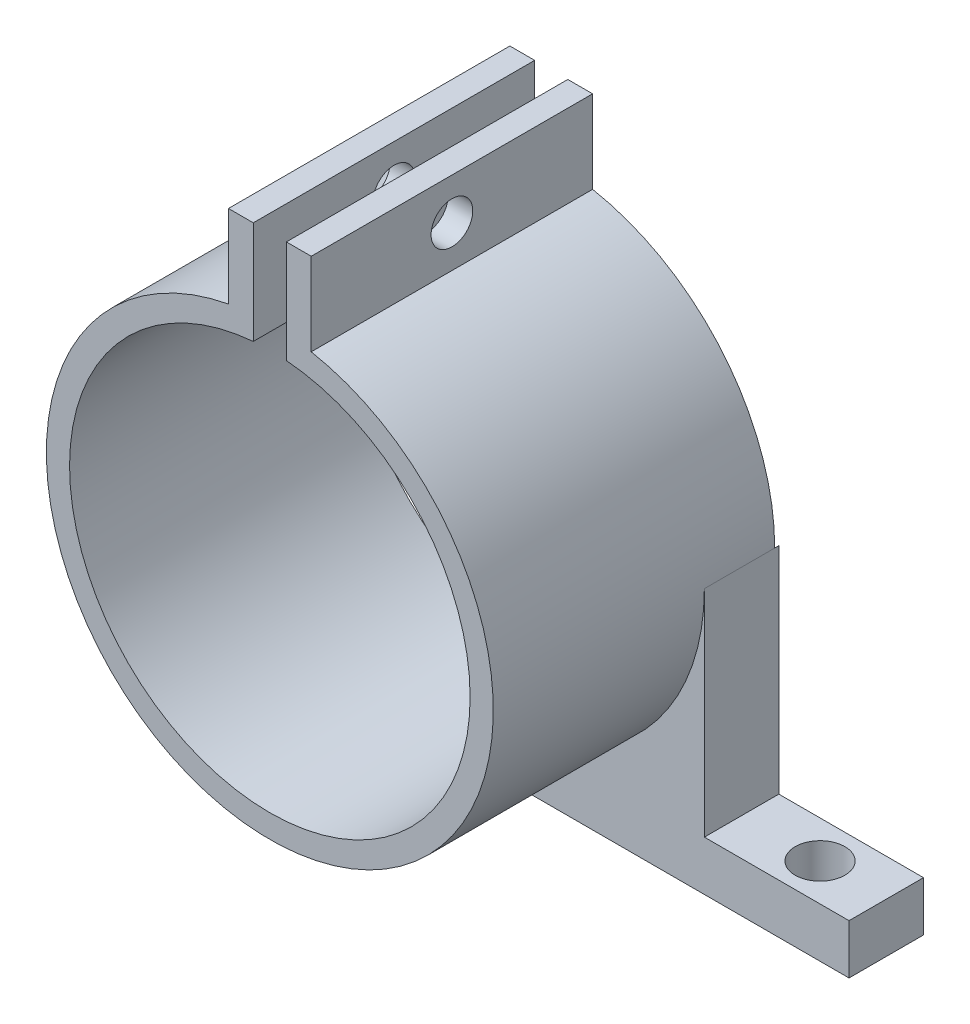
ISO-10303-21;
HEADER;
FILE_DESCRIPTION(('STEP AP214'),'2;1');
FILE_NAME('part.step','',(''),(''),'','','');
FILE_SCHEMA(('AUTOMOTIVE_DESIGN { 1 0 10303 214 1 1 1 1 }'));
ENDSEC;
DATA;
#1=APPLICATION_CONTEXT('core data for automotive mechanical design processes');
#2=APPLICATION_PROTOCOL_DEFINITION('international standard','automotive_design',2000,#1);
#3=PRODUCT_CONTEXT('',#1,'mechanical');
#4=PRODUCT('Part','Part','',(#3));
#5=PRODUCT_RELATED_PRODUCT_CATEGORY('part','',(#4));
#6=PRODUCT_DEFINITION_FORMATION('','',#4);
#7=PRODUCT_DEFINITION_CONTEXT('part definition',#1,'design');
#8=PRODUCT_DEFINITION('design','',#6,#7);
#9=PRODUCT_DEFINITION_SHAPE('','',#8);
#10=(LENGTH_UNIT() NAMED_UNIT(*) SI_UNIT(.MILLI.,.METRE.));
#11=(NAMED_UNIT(*) PLANE_ANGLE_UNIT() SI_UNIT($,.RADIAN.));
#12=(NAMED_UNIT(*) SI_UNIT($,.STERADIAN.) SOLID_ANGLE_UNIT());
#13=UNCERTAINTY_MEASURE_WITH_UNIT(LENGTH_MEASURE(1.E-05),#10,'distance_accuracy_value','');
#14=(GEOMETRIC_REPRESENTATION_CONTEXT(3) GLOBAL_UNCERTAINTY_ASSIGNED_CONTEXT((#13)) GLOBAL_UNIT_ASSIGNED_CONTEXT((#10,
#11,#12)) REPRESENTATION_CONTEXT('',''));
#15=CARTESIAN_POINT('',(0.,0.,0.));
#16=DIRECTION('',(0.,0.,1.));
#17=DIRECTION('',(1.,0.,0.));
#18=AXIS2_PLACEMENT_3D('',#15,#16,#17);
#19=CARTESIAN_POINT('',(0.,3.,0.));
#20=DIRECTION('',(0.,1.,0.));
#21=DIRECTION('',(0.,0.,1.));
#22=AXIS2_PLACEMENT_3D('',#19,#20,#21);
#23=PLANE('',#22);
#24=CARTESIAN_POINT('',(-18.24,3.,0.));
#25=DIRECTION('',(0.,1.,0.));
#26=DIRECTION('',(0.,0.,1.));
#27=AXIS2_PLACEMENT_3D('',#24,#25,#26);
#28=CIRCLE('',#27,1.5);
#29=CARTESIAN_POINT('',(-18.24,3.,1.5));
#30=VERTEX_POINT('',#29);
#31=EDGE_CURVE('E332',#30,#30,#28,.T.);
#32=ORIENTED_EDGE('',*,*,#31,.F.);
#33=EDGE_LOOP('',(#32));
#34=FACE_BOUND('',#33,.T.);
#35=DIRECTION('',(1.,0.,0.));
#36=VECTOR('',#35,1.);
#37=CARTESIAN_POINT('',(-22.24,3.,2.25));
#38=LINE('',#37,#36);
#39=CARTESIAN_POINT('',(-22.24,3.,2.25));
#40=VERTEX_POINT('',#39);
#41=CARTESIAN_POINT('',(-13.5,3.,2.25));
#42=VERTEX_POINT('',#41);
#43=EDGE_CURVE('E353',#40,#42,#38,.T.);
#44=ORIENTED_EDGE('',*,*,#43,.T.);
#45=DIRECTION('',(0.,0.,-1.));
#46=VECTOR('',#45,1.);
#47=CARTESIAN_POINT('',(-13.5,3.,2.25));
#48=LINE('',#47,#46);
#49=CARTESIAN_POINT('',(-13.5,3.,-2.25));
#50=VERTEX_POINT('',#49);
#51=EDGE_CURVE('E63',#42,#50,#48,.T.);
#52=ORIENTED_EDGE('',*,*,#51,.T.);
#53=DIRECTION('',(-1.,0.,0.));
#54=VECTOR('',#53,1.);
#55=CARTESIAN_POINT('',(-22.24,3.,-2.25));
#56=LINE('',#55,#54);
#57=CARTESIAN_POINT('',(-22.24,3.,-2.25));
#58=VERTEX_POINT('',#57);
#59=EDGE_CURVE('E190',#50,#58,#56,.T.);
#60=ORIENTED_EDGE('',*,*,#59,.T.);
#61=DIRECTION('',(0.,0.,1.));
#62=VECTOR('',#61,1.);
#63=CARTESIAN_POINT('',(-22.24,3.,-2.25));
#64=LINE('',#63,#62);
#65=EDGE_CURVE('E348',#58,#40,#64,.T.);
#66=ORIENTED_EDGE('',*,*,#65,.T.);
#67=EDGE_LOOP('',(#44,#52,#60,#66));
#68=FACE_BOUND('',#67,.T.);
#69=ADVANCED_FACE('F39',(#34,#68),#23,.T.);
#70=DIRECTION('',(0.,0.,-1.));
#71=VECTOR('',#70,1.);
#72=CARTESIAN_POINT('',(-3.64005494464025,3.,2.25));
#73=LINE('',#72,#71);
#74=CARTESIAN_POINT('',(-3.64005494464025,3.,-2.));
#75=VERTEX_POINT('',#74);
#76=CARTESIAN_POINT('',(-3.64005494464025,3.,-2.25));
#77=VERTEX_POINT('',#76);
#78=EDGE_CURVE('E197',#75,#77,#73,.T.);
#79=ORIENTED_EDGE('',*,*,#78,.F.);
#80=DIRECTION('',(1.,0.,0.));
#81=VECTOR('',#80,1.);
#82=CARTESIAN_POINT('',(0.,3.,-2.));
#83=LINE('',#82,#81);
#84=CARTESIAN_POINT('',(3.64005494464025,3.,-2.));
#85=VERTEX_POINT('',#84);
#86=EDGE_CURVE('E11',#75,#85,#83,.T.);
#87=ORIENTED_EDGE('',*,*,#86,.T.);
#88=DIRECTION('',(0.,0.,-1.));
#89=VECTOR('',#88,1.);
#90=CARTESIAN_POINT('',(3.64005494464025,3.,2.25));
#91=LINE('',#90,#89);
#92=CARTESIAN_POINT('',(3.64005494464025,3.,-2.25));
#93=VERTEX_POINT('',#92);
#94=EDGE_CURVE('E233',#85,#93,#91,.T.);
#95=ORIENTED_EDGE('',*,*,#94,.T.);
#96=EDGE_CURVE('E349',#93,#77,#56,.T.);
#97=ORIENTED_EDGE('',*,*,#96,.T.);
#98=EDGE_LOOP('',(#79,#87,#95,#97));
#99=FACE_BOUND('',#98,.T.);
#100=ADVANCED_FACE('F427',(#99),#23,.T.);
#101=CARTESIAN_POINT('',(0.,16.,-2.));
#102=DIRECTION('',(0.,0.,1.));
#103=DIRECTION('',(1.,0.,0.));
#104=AXIS2_PLACEMENT_3D('',#101,#102,#103);
#105=CYLINDRICAL_SURFACE('',#104,13.5);
#106=DIRECTION('',(0.,0.,-1.));
#107=VECTOR('',#106,1.);
#108=CARTESIAN_POINT('',(-13.5,16.,2.25));
#109=LINE('',#108,#107);
#110=CARTESIAN_POINT('',(-13.5,16.,2.25));
#111=VERTEX_POINT('',#110);
#112=CARTESIAN_POINT('',(-13.5,16.,-2.));
#113=VERTEX_POINT('',#112);
#114=EDGE_CURVE('E178',#111,#113,#109,.T.);
#115=ORIENTED_EDGE('',*,*,#114,.F.);
#116=CARTESIAN_POINT('',(0.,16.,2.25));
#117=DIRECTION('',(0.,0.,-1.));
#118=DIRECTION('',(-1.,0.,0.));
#119=AXIS2_PLACEMENT_3D('',#116,#117,#118);
#120=CIRCLE('',#119,13.5);
#121=CARTESIAN_POINT('',(13.5,16.,2.25));
#122=VERTEX_POINT('',#121);
#123=EDGE_CURVE('E49',#122,#111,#120,.T.);
#124=ORIENTED_EDGE('',*,*,#123,.F.);
#125=DIRECTION('',(0.,0.,-1.));
#126=VECTOR('',#125,1.);
#127=CARTESIAN_POINT('',(13.5,16.,2.25));
#128=LINE('',#127,#126);
#129=CARTESIAN_POINT('',(13.5,16.,-2.));
#130=VERTEX_POINT('',#129);
#131=EDGE_CURVE('E225',#122,#130,#128,.T.);
#132=ORIENTED_EDGE('',*,*,#131,.T.);
#133=CARTESIAN_POINT('',(0.,16.,-2.));
#134=DIRECTION('',(0.,0.,1.));
#135=DIRECTION('',(1.,0.,0.));
#136=AXIS2_PLACEMENT_3D('',#133,#134,#135);
#137=CIRCLE('',#136,13.5);
#138=CARTESIAN_POINT('',(2.5,29.2664991614216,-2.));
#139=VERTEX_POINT('',#138);
#140=EDGE_CURVE('E272',#130,#139,#137,.T.);
#141=ORIENTED_EDGE('',*,*,#140,.T.);
#142=DIRECTION('',(0.,0.,1.));
#143=VECTOR('',#142,1.);
#144=CARTESIAN_POINT('',(2.5,29.2664991614216,-2.));
#145=LINE('',#144,#143);
#146=CARTESIAN_POINT('',(2.5,29.2664991614216,15.));
#147=VERTEX_POINT('',#146);
#148=EDGE_CURVE('E319',#139,#147,#145,.T.);
#149=ORIENTED_EDGE('',*,*,#148,.T.);
#150=CARTESIAN_POINT('',(0.,16.,15.));
#151=DIRECTION('',(0.,0.,1.));
#152=DIRECTION('',(1.,0.,0.));
#153=AXIS2_PLACEMENT_3D('',#150,#151,#152);
#154=CIRCLE('',#153,13.5);
#155=CARTESIAN_POINT('',(-2.5,29.2664991614216,15.));
#156=VERTEX_POINT('',#155);
#157=EDGE_CURVE('E240',#156,#147,#154,.T.);
#158=ORIENTED_EDGE('',*,*,#157,.F.);
#159=DIRECTION('',(0.,0.,1.));
#160=VECTOR('',#159,1.);
#161=CARTESIAN_POINT('',(-2.5,29.2664991614216,-2.));
#162=LINE('',#161,#160);
#163=CARTESIAN_POINT('',(-2.5,29.2664991614216,-2.));
#164=VERTEX_POINT('',#163);
#165=EDGE_CURVE('E299',#164,#156,#162,.T.);
#166=ORIENTED_EDGE('',*,*,#165,.F.);
#167=EDGE_CURVE('E273',#164,#113,#137,.T.);
#168=ORIENTED_EDGE('',*,*,#167,.T.);
#169=EDGE_LOOP('',(#115,#124,#132,#141,#149,#158,#166,#168));
#170=FACE_BOUND('',#169,.T.);
#171=ADVANCED_FACE('F419',(#170),#105,.T.);
#172=DIRECTION('',(0.,0.,-1.));
#173=VECTOR('',#172,1.);
#174=CARTESIAN_POINT('',(13.5,3.,2.25));
#175=LINE('',#174,#173);
#176=CARTESIAN_POINT('',(13.5,3.,2.25));
#177=VERTEX_POINT('',#176);
#178=CARTESIAN_POINT('',(13.5,3.,-2.25));
#179=VERTEX_POINT('',#178);
#180=EDGE_CURVE('E229',#177,#179,#175,.T.);
#181=ORIENTED_EDGE('',*,*,#180,.F.);
#182=CARTESIAN_POINT('',(22.24,3.,2.25));
#183=VERTEX_POINT('',#182);
#184=EDGE_CURVE('E352',#177,#183,#38,.T.);
#185=ORIENTED_EDGE('',*,*,#184,.T.);
#186=DIRECTION('',(0.,0.,-1.));
#187=VECTOR('',#186,1.);
#188=CARTESIAN_POINT('',(22.24,3.,-2.25));
#189=LINE('',#188,#187);
#190=CARTESIAN_POINT('',(22.24,3.,-2.25));
#191=VERTEX_POINT('',#190);
#192=EDGE_CURVE('E340',#183,#191,#189,.T.);
#193=ORIENTED_EDGE('',*,*,#192,.T.);
#194=EDGE_CURVE('E345',#191,#179,#56,.T.);
#195=ORIENTED_EDGE('',*,*,#194,.T.);
#196=EDGE_LOOP('',(#181,#185,#193,#195));
#197=FACE_BOUND('',#196,.T.);
#198=CARTESIAN_POINT('',(18.24,3.,0.));
#199=DIRECTION('',(0.,1.,0.));
#200=DIRECTION('',(0.,0.,1.));
#201=AXIS2_PLACEMENT_3D('',#198,#199,#200);
#202=CIRCLE('',#201,1.5);
#203=CARTESIAN_POINT('',(18.24,3.,1.5));
#204=VERTEX_POINT('',#203);
#205=EDGE_CURVE('E324',#204,#204,#202,.T.);
#206=ORIENTED_EDGE('',*,*,#205,.F.);
#207=EDGE_LOOP('',(#206));
#208=FACE_BOUND('',#207,.T.);
#209=ADVANCED_FACE('F411',(#197,#208),#23,.T.);
#210=CARTESIAN_POINT('',(0.,0.,0.));
#211=DIRECTION('',(0.,1.,0.));
#212=DIRECTION('',(0.,0.,1.));
#213=AXIS2_PLACEMENT_3D('',#210,#211,#212);
#214=PLANE('',#213);
#215=DIRECTION('',(0.,0.,-1.));
#216=VECTOR('',#215,1.);
#217=CARTESIAN_POINT('',(22.24,0.,-2.25));
#218=LINE('',#217,#216);
#219=CARTESIAN_POINT('',(22.24,0.,2.25));
#220=VERTEX_POINT('',#219);
#221=CARTESIAN_POINT('',(22.24,0.,-2.25));
#222=VERTEX_POINT('',#221);
#223=EDGE_CURVE('E336',#220,#222,#218,.T.);
#224=ORIENTED_EDGE('',*,*,#223,.F.);
#225=DIRECTION('',(1.,0.,0.));
#226=VECTOR('',#225,1.);
#227=CARTESIAN_POINT('',(-22.24,0.,2.25));
#228=LINE('',#227,#226);
#229=CARTESIAN_POINT('',(-22.24,0.,2.25));
#230=VERTEX_POINT('',#229);
#231=EDGE_CURVE('E344',#230,#220,#228,.T.);
#232=ORIENTED_EDGE('',*,*,#231,.F.);
#233=DIRECTION('',(0.,0.,1.));
#234=VECTOR('',#233,1.);
#235=CARTESIAN_POINT('',(-22.24,0.,-2.25));
#236=LINE('',#235,#234);
#237=CARTESIAN_POINT('',(-22.24,0.,-2.25));
#238=VERTEX_POINT('',#237);
#239=EDGE_CURVE('E363',#238,#230,#236,.T.);
#240=ORIENTED_EDGE('',*,*,#239,.F.);
#241=DIRECTION('',(-1.,0.,0.));
#242=VECTOR('',#241,1.);
#243=CARTESIAN_POINT('',(-22.24,0.,-2.25));
#244=LINE('',#243,#242);
#245=EDGE_CURVE('E360',#222,#238,#244,.T.);
#246=ORIENTED_EDGE('',*,*,#245,.F.);
#247=EDGE_LOOP('',(#224,#232,#240,#246));
#248=FACE_BOUND('',#247,.T.);
#249=CARTESIAN_POINT('',(-18.24,0.,0.));
#250=DIRECTION('',(0.,1.,0.));
#251=DIRECTION('',(0.,0.,1.));
#252=AXIS2_PLACEMENT_3D('',#249,#250,#251);
#253=CIRCLE('',#252,1.5);
#254=CARTESIAN_POINT('',(-18.24,0.,1.5));
#255=VERTEX_POINT('',#254);
#256=EDGE_CURVE('E328',#255,#255,#253,.T.);
#257=ORIENTED_EDGE('',*,*,#256,.T.);
#258=EDGE_LOOP('',(#257));
#259=FACE_BOUND('',#258,.T.);
#260=CARTESIAN_POINT('',(18.24,0.,0.));
#261=DIRECTION('',(0.,1.,0.));
#262=DIRECTION('',(0.,0.,1.));
#263=AXIS2_PLACEMENT_3D('',#260,#261,#262);
#264=CIRCLE('',#263,1.5);
#265=CARTESIAN_POINT('',(18.24,0.,1.5));
#266=VERTEX_POINT('',#265);
#267=EDGE_CURVE('E303',#266,#266,#264,.T.);
#268=ORIENTED_EDGE('',*,*,#267,.T.);
#269=EDGE_LOOP('',(#268));
#270=FACE_BOUND('',#269,.T.);
#271=ADVANCED_FACE('F404',(#248,#259,#270),#214,.F.);
#272=CARTESIAN_POINT('',(22.24,3.,-2.25));
#273=DIRECTION('',(-1.,0.,0.));
#274=DIRECTION('',(0.,0.,1.));
#275=AXIS2_PLACEMENT_3D('',#272,#273,#274);
#276=PLANE('',#275);
#277=ORIENTED_EDGE('',*,*,#223,.T.);
#278=DIRECTION('',(0.,-1.,0.));
#279=VECTOR('',#278,1.);
#280=CARTESIAN_POINT('',(22.24,3.,-2.25));
#281=LINE('',#280,#279);
#282=EDGE_CURVE('E379',#191,#222,#281,.T.);
#283=ORIENTED_EDGE('',*,*,#282,.F.);
#284=ORIENTED_EDGE('',*,*,#192,.F.);
#285=DIRECTION('',(0.,-1.,0.));
#286=VECTOR('',#285,1.);
#287=CARTESIAN_POINT('',(22.24,3.,2.25));
#288=LINE('',#287,#286);
#289=EDGE_CURVE('E356',#183,#220,#288,.T.);
#290=ORIENTED_EDGE('',*,*,#289,.T.);
#291=EDGE_LOOP('',(#277,#283,#284,#290));
#292=FACE_BOUND('',#291,.T.);
#293=ADVANCED_FACE('F41',(#292),#276,.F.);
#294=CARTESIAN_POINT('',(-22.24,3.,-2.25));
#295=DIRECTION('',(0.,0.,1.));
#296=DIRECTION('',(1.,0.,0.));
#297=AXIS2_PLACEMENT_3D('',#294,#295,#296);
#298=PLANE('',#297);
#299=ORIENTED_EDGE('',*,*,#245,.T.);
#300=DIRECTION('',(0.,-1.,0.));
#301=VECTOR('',#300,1.);
#302=CARTESIAN_POINT('',(-22.24,3.,-2.25));
#303=LINE('',#302,#301);
#304=EDGE_CURVE('E375',#58,#238,#303,.T.);
#305=ORIENTED_EDGE('',*,*,#304,.F.);
#306=ORIENTED_EDGE('',*,*,#59,.F.);
#307=DIRECTION('',(0.,-1.,0.));
#308=VECTOR('',#307,1.);
#309=CARTESIAN_POINT('',(-13.5,0.,-2.25));
#310=LINE('',#309,#308);
#311=CARTESIAN_POINT('',(-13.5,16.,-2.25));
#312=VERTEX_POINT('',#311);
#313=EDGE_CURVE('E176',#312,#50,#310,.T.);
#314=ORIENTED_EDGE('',*,*,#313,.F.);
#315=CARTESIAN_POINT('',(0.,16.,-2.25));
#316=DIRECTION('',(0.,0.,1.));
#317=DIRECTION('',(1.,0.,0.));
#318=AXIS2_PLACEMENT_3D('',#315,#316,#317);
#319=CIRCLE('',#318,13.5);
#320=EDGE_CURVE('E188',#312,#77,#319,.T.);
#321=ORIENTED_EDGE('',*,*,#320,.T.);
#322=ORIENTED_EDGE('',*,*,#96,.F.);
#323=CARTESIAN_POINT('',(0.,16.,-2.25));
#324=DIRECTION('',(0.,0.,1.));
#325=DIRECTION('',(1.,0.,0.));
#326=AXIS2_PLACEMENT_3D('',#323,#324,#325);
#327=CIRCLE('',#326,13.5);
#328=CARTESIAN_POINT('',(13.5,16.,-2.25));
#329=VERTEX_POINT('',#328);
#330=EDGE_CURVE('E212',#93,#329,#327,.T.);
#331=ORIENTED_EDGE('',*,*,#330,.T.);
#332=DIRECTION('',(0.,-1.,0.));
#333=VECTOR('',#332,1.);
#334=CARTESIAN_POINT('',(13.5,0.,-2.25));
#335=LINE('',#334,#333);
#336=EDGE_CURVE('E218',#329,#179,#335,.T.);
#337=ORIENTED_EDGE('',*,*,#336,.T.);
#338=ORIENTED_EDGE('',*,*,#194,.F.);
#339=ORIENTED_EDGE('',*,*,#282,.T.);
#340=EDGE_LOOP('',(#299,#305,#306,#314,#321,#322,#331,#337,#338,#339));
#341=FACE_BOUND('',#340,.T.);
#342=ADVANCED_FACE('F186',(#341),#298,.F.);
#343=CARTESIAN_POINT('',(-22.24,3.,-2.25));
#344=DIRECTION('',(1.,0.,0.));
#345=DIRECTION('',(0.,0.,-1.));
#346=AXIS2_PLACEMENT_3D('',#343,#344,#345);
#347=PLANE('',#346);
#348=ORIENTED_EDGE('',*,*,#239,.T.);
#349=DIRECTION('',(0.,-1.,0.));
#350=VECTOR('',#349,1.);
#351=CARTESIAN_POINT('',(-22.24,3.,2.25));
#352=LINE('',#351,#350);
#353=EDGE_CURVE('E371',#40,#230,#352,.T.);
#354=ORIENTED_EDGE('',*,*,#353,.F.);
#355=ORIENTED_EDGE('',*,*,#65,.F.);
#356=ORIENTED_EDGE('',*,*,#304,.T.);
#357=EDGE_LOOP('',(#348,#354,#355,#356));
#358=FACE_BOUND('',#357,.T.);
#359=ADVANCED_FACE('F400',(#358),#347,.F.);
#360=CARTESIAN_POINT('',(-22.24,3.,2.25));
#361=DIRECTION('',(0.,0.,-1.));
#362=DIRECTION('',(-1.,0.,0.));
#363=AXIS2_PLACEMENT_3D('',#360,#361,#362);
#364=PLANE('',#363);
#365=ORIENTED_EDGE('',*,*,#184,.F.);
#366=DIRECTION('',(0.,-1.,0.));
#367=VECTOR('',#366,1.);
#368=CARTESIAN_POINT('',(13.5,0.,2.25));
#369=LINE('',#368,#367);
#370=EDGE_CURVE('E213',#122,#177,#369,.T.);
#371=ORIENTED_EDGE('',*,*,#370,.F.);
#372=ORIENTED_EDGE('',*,*,#123,.T.);
#373=DIRECTION('',(0.,-1.,0.));
#374=VECTOR('',#373,1.);
#375=CARTESIAN_POINT('',(-13.5,0.,2.25));
#376=LINE('',#375,#374);
#377=EDGE_CURVE('E192',#111,#42,#376,.T.);
#378=ORIENTED_EDGE('',*,*,#377,.T.);
#379=ORIENTED_EDGE('',*,*,#43,.F.);
#380=ORIENTED_EDGE('',*,*,#353,.T.);
#381=ORIENTED_EDGE('',*,*,#231,.T.);
#382=ORIENTED_EDGE('',*,*,#289,.F.);
#383=EDGE_LOOP('',(#365,#371,#372,#378,#379,#380,#381,#382));
#384=FACE_BOUND('',#383,.T.);
#385=ADVANCED_FACE('F395',(#384),#364,.F.);
#386=CARTESIAN_POINT('',(-18.24,3.,0.));
#387=DIRECTION('',(0.,-1.,0.));
#388=DIRECTION('',(0.,0.,-1.));
#389=AXIS2_PLACEMENT_3D('',#386,#387,#388);
#390=CYLINDRICAL_SURFACE('',#389,1.5);
#391=ORIENTED_EDGE('',*,*,#31,.T.);
#392=EDGE_LOOP('',(#391));
#393=FACE_BOUND('',#392,.T.);
#394=ORIENTED_EDGE('',*,*,#256,.F.);
#395=EDGE_LOOP('',(#394));
#396=FACE_BOUND('',#395,.T.);
#397=ADVANCED_FACE('F500',(#393,#396),#390,.F.);
#398=CARTESIAN_POINT('',(18.24,3.,0.));
#399=DIRECTION('',(0.,-1.,0.));
#400=DIRECTION('',(0.,0.,-1.));
#401=AXIS2_PLACEMENT_3D('',#398,#399,#400);
#402=CYLINDRICAL_SURFACE('',#401,1.5);
#403=ORIENTED_EDGE('',*,*,#205,.T.);
#404=EDGE_LOOP('',(#403));
#405=FACE_BOUND('',#404,.T.);
#406=ORIENTED_EDGE('',*,*,#267,.F.);
#407=EDGE_LOOP('',(#406));
#408=FACE_BOUND('',#407,.T.);
#409=ADVANCED_FACE('F497',(#405,#408),#402,.F.);
#410=CARTESIAN_POINT('',(-2.5,0.,-2.));
#411=DIRECTION('',(1.,0.,0.));
#412=DIRECTION('',(0.,0.,-1.));
#413=AXIS2_PLACEMENT_3D('',#410,#411,#412);
#414=PLANE('',#413);
#415=CARTESIAN_POINT('',(-2.5,31.7664991614216,6.5));
#416=DIRECTION('',(1.,0.,0.));
#417=DIRECTION('',(0.,0.,-1.));
#418=AXIS2_PLACEMENT_3D('',#415,#416,#417);
#419=CIRCLE('',#418,1.25873614412771);
#420=CARTESIAN_POINT('',(-2.5,31.7664991614216,5.24126385587229));
#421=VERTEX_POINT('',#420);
#422=EDGE_CURVE('E199',#421,#421,#419,.T.);
#423=ORIENTED_EDGE('',*,*,#422,.T.);
#424=EDGE_LOOP('',(#423));
#425=FACE_BOUND('',#424,.T.);
#426=ORIENTED_EDGE('',*,*,#165,.T.);
#427=DIRECTION('',(0.,1.,0.));
#428=VECTOR('',#427,1.);
#429=CARTESIAN_POINT('',(-2.5,0.,15.));
#430=LINE('',#429,#428);
#431=CARTESIAN_POINT('',(-2.5,34.2664991614216,15.));
#432=VERTEX_POINT('',#431);
#433=EDGE_CURVE('E236',#156,#432,#430,.T.);
#434=ORIENTED_EDGE('',*,*,#433,.T.);
#435=DIRECTION('',(0.,0.,1.));
#436=VECTOR('',#435,1.);
#437=CARTESIAN_POINT('',(-2.5,34.2664991614216,-2.));
#438=LINE('',#437,#436);
#439=CARTESIAN_POINT('',(-2.5,34.2664991614216,-2.));
#440=VERTEX_POINT('',#439);
#441=EDGE_CURVE('E300',#440,#432,#438,.T.);
#442=ORIENTED_EDGE('',*,*,#441,.F.);
#443=DIRECTION('',(0.,1.,0.));
#444=VECTOR('',#443,1.);
#445=CARTESIAN_POINT('',(-2.5,0.,-2.));
#446=LINE('',#445,#444);
#447=EDGE_CURVE('E268',#164,#440,#446,.T.);
#448=ORIENTED_EDGE('',*,*,#447,.F.);
#449=EDGE_LOOP('',(#426,#434,#442,#448));
#450=FACE_BOUND('',#449,.T.);
#451=ADVANCED_FACE('F434',(#425,#450),#414,.F.);
#452=CARTESIAN_POINT('',(0.,34.2664991614216,-2.));
#453=DIRECTION('',(0.,-1.,0.));
#454=DIRECTION('',(0.,0.,-1.));
#455=AXIS2_PLACEMENT_3D('',#452,#453,#454);
#456=PLANE('',#455);
#457=ORIENTED_EDGE('',*,*,#441,.T.);
#458=DIRECTION('',(1.,0.,0.));
#459=VECTOR('',#458,1.);
#460=CARTESIAN_POINT('',(0.,34.2664991614216,15.));
#461=LINE('',#460,#459);
#462=CARTESIAN_POINT('',(-1.00000000000001,34.2664991614216,15.));
#463=VERTEX_POINT('',#462);
#464=EDGE_CURVE('E264',#432,#463,#461,.T.);
#465=ORIENTED_EDGE('',*,*,#464,.T.);
#466=DIRECTION('',(0.,0.,1.));
#467=VECTOR('',#466,1.);
#468=CARTESIAN_POINT('',(-1.00000000000001,34.2664991614216,-2.));
#469=LINE('',#468,#467);
#470=CARTESIAN_POINT('',(-1.00000000000001,34.2664991614216,-2.));
#471=VERTEX_POINT('',#470);
#472=EDGE_CURVE('E304',#471,#463,#469,.T.);
#473=ORIENTED_EDGE('',*,*,#472,.F.);
#474=DIRECTION('',(1.,0.,0.));
#475=VECTOR('',#474,1.);
#476=CARTESIAN_POINT('',(0.,34.2664991614216,-2.));
#477=LINE('',#476,#475);
#478=EDGE_CURVE('E296',#440,#471,#477,.T.);
#479=ORIENTED_EDGE('',*,*,#478,.F.);
#480=EDGE_LOOP('',(#457,#465,#473,#479));
#481=FACE_BOUND('',#480,.T.);
#482=ADVANCED_FACE('F439',(#481),#456,.F.);
#483=CARTESIAN_POINT('',(-0.999999999999996,0.,-2.));
#484=DIRECTION('',(-1.,0.,0.));
#485=DIRECTION('',(0.,-1.,0.));
#486=AXIS2_PLACEMENT_3D('',#483,#484,#485);
#487=PLANE('',#486);
#488=CARTESIAN_POINT('',(-1.00000000000001,31.7664991614216,6.5));
#489=DIRECTION('',(-1.,0.,0.));
#490=DIRECTION('',(0.,-1.,0.));
#491=AXIS2_PLACEMENT_3D('',#488,#489,#490);
#492=CIRCLE('',#491,1.25873614412771);
#493=CARTESIAN_POINT('',(-1.00000000000001,30.5077630172939,6.5));
#494=VERTEX_POINT('',#493);
#495=EDGE_CURVE('E203',#494,#494,#492,.T.);
#496=ORIENTED_EDGE('',*,*,#495,.T.);
#497=EDGE_LOOP('',(#496));
#498=FACE_BOUND('',#497,.T.);
#499=ORIENTED_EDGE('',*,*,#472,.T.);
#500=DIRECTION('',(0.,-1.,0.));
#501=VECTOR('',#500,1.);
#502=CARTESIAN_POINT('',(-0.999999999999996,0.,15.));
#503=LINE('',#502,#501);
#504=CARTESIAN_POINT('',(-1.,28.058606884711,15.));
#505=VERTEX_POINT('',#504);
#506=EDGE_CURVE('E260',#463,#505,#503,.T.);
#507=ORIENTED_EDGE('',*,*,#506,.T.);
#508=DIRECTION('',(0.,0.,1.));
#509=VECTOR('',#508,1.);
#510=CARTESIAN_POINT('',(-1.,28.058606884711,-2.));
#511=LINE('',#510,#509);
#512=CARTESIAN_POINT('',(-1.,28.058606884711,-2.));
#513=VERTEX_POINT('',#512);
#514=EDGE_CURVE('E307',#513,#505,#511,.T.);
#515=ORIENTED_EDGE('',*,*,#514,.F.);
#516=DIRECTION('',(0.,-1.,0.));
#517=VECTOR('',#516,1.);
#518=CARTESIAN_POINT('',(-0.999999999999996,0.,-2.));
#519=LINE('',#518,#517);
#520=EDGE_CURVE('E293',#471,#513,#519,.T.);
#521=ORIENTED_EDGE('',*,*,#520,.F.);
#522=EDGE_LOOP('',(#499,#507,#515,#521));
#523=FACE_BOUND('',#522,.T.);
#524=ADVANCED_FACE('F443',(#498,#523),#487,.F.);
#525=CARTESIAN_POINT('',(0.,16.,-2.));
#526=DIRECTION('',(0.,0.,1.));
#527=DIRECTION('',(1.,0.,0.));
#528=AXIS2_PLACEMENT_3D('',#525,#526,#527);
#529=CYLINDRICAL_SURFACE('',#528,12.1);
#530=ORIENTED_EDGE('',*,*,#514,.T.);
#531=CARTESIAN_POINT('',(0.,16.,15.));
#532=DIRECTION('',(0.,0.,1.));
#533=DIRECTION('',(1.,0.,0.));
#534=AXIS2_PLACEMENT_3D('',#531,#532,#533);
#535=CIRCLE('',#534,12.1);
#536=CARTESIAN_POINT('',(0.999999999999995,28.058606884711,15.));
#537=VERTEX_POINT('',#536);
#538=EDGE_CURVE('E256',#505,#537,#535,.T.);
#539=ORIENTED_EDGE('',*,*,#538,.T.);
#540=DIRECTION('',(0.,0.,1.));
#541=VECTOR('',#540,1.);
#542=CARTESIAN_POINT('',(0.999999999999995,28.058606884711,-2.));
#543=LINE('',#542,#541);
#544=CARTESIAN_POINT('',(0.999999999999995,28.058606884711,-2.));
#545=VERTEX_POINT('',#544);
#546=EDGE_CURVE('E310',#545,#537,#543,.T.);
#547=ORIENTED_EDGE('',*,*,#546,.F.);
#548=CARTESIAN_POINT('',(0.,16.,-2.));
#549=DIRECTION('',(0.,0.,1.));
#550=DIRECTION('',(1.,0.,0.));
#551=AXIS2_PLACEMENT_3D('',#548,#549,#550);
#552=CIRCLE('',#551,12.1);
#553=EDGE_CURVE('E290',#513,#545,#552,.T.);
#554=ORIENTED_EDGE('',*,*,#553,.F.);
#555=EDGE_LOOP('',(#530,#539,#547,#554));
#556=FACE_BOUND('',#555,.T.);
#557=ADVANCED_FACE('F448',(#556),#529,.F.);
#558=CARTESIAN_POINT('',(1.,0.,-2.));
#559=DIRECTION('',(-1.,0.,0.));
#560=DIRECTION('',(0.,-1.,0.));
#561=AXIS2_PLACEMENT_3D('',#558,#559,#560);
#562=PLANE('',#561);
#563=CARTESIAN_POINT('',(0.999999999999994,31.7664991614216,6.5));
#564=DIRECTION('',(-1.,0.,0.));
#565=DIRECTION('',(0.,-1.,0.));
#566=AXIS2_PLACEMENT_3D('',#563,#564,#565);
#567=CIRCLE('',#566,1.25873614412771);
#568=CARTESIAN_POINT('',(0.999999999999994,30.5077630172939,6.5));
#569=VERTEX_POINT('',#568);
#570=EDGE_CURVE('E686',#569,#569,#567,.T.);
#571=ORIENTED_EDGE('',*,*,#570,.F.);
#572=EDGE_LOOP('',(#571));
#573=FACE_BOUND('',#572,.T.);
#574=ORIENTED_EDGE('',*,*,#546,.T.);
#575=DIRECTION('',(0.,-1.,0.));
#576=VECTOR('',#575,1.);
#577=CARTESIAN_POINT('',(1.,0.,15.));
#578=LINE('',#577,#576);
#579=CARTESIAN_POINT('',(0.999999999999994,34.2664991614216,15.));
#580=VERTEX_POINT('',#579);
#581=EDGE_CURVE('E252',#580,#537,#578,.T.);
#582=ORIENTED_EDGE('',*,*,#581,.F.);
#583=DIRECTION('',(0.,0.,1.));
#584=VECTOR('',#583,1.);
#585=CARTESIAN_POINT('',(0.999999999999994,34.2664991614216,-2.));
#586=LINE('',#585,#584);
#587=CARTESIAN_POINT('',(0.999999999999994,34.2664991614216,-2.));
#588=VERTEX_POINT('',#587);
#589=EDGE_CURVE('E313',#588,#580,#586,.T.);
#590=ORIENTED_EDGE('',*,*,#589,.F.);
#591=DIRECTION('',(0.,-1.,0.));
#592=VECTOR('',#591,1.);
#593=CARTESIAN_POINT('',(1.,0.,-2.));
#594=LINE('',#593,#592);
#595=EDGE_CURVE('E286',#588,#545,#594,.T.);
#596=ORIENTED_EDGE('',*,*,#595,.T.);
#597=EDGE_LOOP('',(#574,#582,#590,#596));
#598=FACE_BOUND('',#597,.T.);
#599=ADVANCED_FACE('F453',(#573,#598),#562,.T.);
#600=CARTESIAN_POINT('',(0.,34.2664991614216,-2.));
#601=DIRECTION('',(0.,-1.,0.));
#602=DIRECTION('',(0.,0.,-1.));
#603=AXIS2_PLACEMENT_3D('',#600,#601,#602);
#604=PLANE('',#603);
#605=ORIENTED_EDGE('',*,*,#589,.T.);
#606=DIRECTION('',(1.,0.,0.));
#607=VECTOR('',#606,1.);
#608=CARTESIAN_POINT('',(0.,34.2664991614216,15.));
#609=LINE('',#608,#607);
#610=CARTESIAN_POINT('',(2.5,34.2664991614216,15.));
#611=VERTEX_POINT('',#610);
#612=EDGE_CURVE('E248',#580,#611,#609,.T.);
#613=ORIENTED_EDGE('',*,*,#612,.T.);
#614=DIRECTION('',(0.,0.,1.));
#615=VECTOR('',#614,1.);
#616=CARTESIAN_POINT('',(2.5,34.2664991614216,-2.));
#617=LINE('',#616,#615);
#618=CARTESIAN_POINT('',(2.5,34.2664991614216,-2.));
#619=VERTEX_POINT('',#618);
#620=EDGE_CURVE('E316',#619,#611,#617,.T.);
#621=ORIENTED_EDGE('',*,*,#620,.F.);
#622=DIRECTION('',(1.,0.,0.));
#623=VECTOR('',#622,1.);
#624=CARTESIAN_POINT('',(0.,34.2664991614216,-2.));
#625=LINE('',#624,#623);
#626=EDGE_CURVE('E283',#588,#619,#625,.T.);
#627=ORIENTED_EDGE('',*,*,#626,.F.);
#628=EDGE_LOOP('',(#605,#613,#621,#627));
#629=FACE_BOUND('',#628,.T.);
#630=ADVANCED_FACE('F457',(#629),#604,.F.);
#631=CARTESIAN_POINT('',(2.5,0.,-2.));
#632=DIRECTION('',(-1.,0.,0.));
#633=DIRECTION('',(0.,-1.,0.));
#634=AXIS2_PLACEMENT_3D('',#631,#632,#633);
#635=PLANE('',#634);
#636=CARTESIAN_POINT('',(2.5,31.7664991614216,6.5));
#637=DIRECTION('',(-1.,0.,0.));
#638=DIRECTION('',(0.,-1.,0.));
#639=AXIS2_PLACEMENT_3D('',#636,#637,#638);
#640=CIRCLE('',#639,1.25873614412771);
#641=CARTESIAN_POINT('',(2.5,30.5077630172939,6.5));
#642=VERTEX_POINT('',#641);
#643=EDGE_CURVE('E43',#642,#642,#640,.T.);
#644=ORIENTED_EDGE('',*,*,#643,.T.);
#645=EDGE_LOOP('',(#644));
#646=FACE_BOUND('',#645,.T.);
#647=ORIENTED_EDGE('',*,*,#620,.T.);
#648=DIRECTION('',(0.,-1.,0.));
#649=VECTOR('',#648,1.);
#650=CARTESIAN_POINT('',(2.5,0.,15.));
#651=LINE('',#650,#649);
#652=EDGE_CURVE('E244',#611,#147,#651,.T.);
#653=ORIENTED_EDGE('',*,*,#652,.T.);
#654=ORIENTED_EDGE('',*,*,#148,.F.);
#655=DIRECTION('',(0.,-1.,0.));
#656=VECTOR('',#655,1.);
#657=CARTESIAN_POINT('',(2.5,0.,-2.));
#658=LINE('',#657,#656);
#659=EDGE_CURVE('E277',#619,#139,#658,.T.);
#660=ORIENTED_EDGE('',*,*,#659,.F.);
#661=EDGE_LOOP('',(#647,#653,#654,#660));
#662=FACE_BOUND('',#661,.T.);
#663=ADVANCED_FACE('F462',(#646,#662),#635,.F.);
#664=CARTESIAN_POINT('',(0.,0.,-2.));
#665=DIRECTION('',(0.,0.,1.));
#666=DIRECTION('',(1.,0.,0.));
#667=AXIS2_PLACEMENT_3D('',#664,#665,#666);
#668=PLANE('',#667);
#669=ORIENTED_EDGE('',*,*,#86,.F.);
#670=EDGE_CURVE('E278',#113,#75,#137,.T.);
#671=ORIENTED_EDGE('',*,*,#670,.F.);
#672=ORIENTED_EDGE('',*,*,#167,.F.);
#673=ORIENTED_EDGE('',*,*,#447,.T.);
#674=ORIENTED_EDGE('',*,*,#478,.T.);
#675=ORIENTED_EDGE('',*,*,#520,.T.);
#676=ORIENTED_EDGE('',*,*,#553,.T.);
#677=ORIENTED_EDGE('',*,*,#595,.F.);
#678=ORIENTED_EDGE('',*,*,#626,.T.);
#679=ORIENTED_EDGE('',*,*,#659,.T.);
#680=ORIENTED_EDGE('',*,*,#140,.F.);
#681=EDGE_CURVE('E279',#85,#130,#137,.T.);
#682=ORIENTED_EDGE('',*,*,#681,.F.);
#683=EDGE_LOOP('',(#669,#671,#672,#673,#674,#675,#676,#677,#678,#679,#680,#682));
#684=FACE_BOUND('',#683,.T.);
#685=ADVANCED_FACE('F425',(#684),#668,.F.);
#686=CARTESIAN_POINT('',(0.,0.,15.));
#687=DIRECTION('',(0.,0.,1.));
#688=DIRECTION('',(1.,0.,0.));
#689=AXIS2_PLACEMENT_3D('',#686,#687,#688);
#690=PLANE('',#689);
#691=ORIENTED_EDGE('',*,*,#433,.F.);
#692=ORIENTED_EDGE('',*,*,#157,.T.);
#693=ORIENTED_EDGE('',*,*,#652,.F.);
#694=ORIENTED_EDGE('',*,*,#612,.F.);
#695=ORIENTED_EDGE('',*,*,#581,.T.);
#696=ORIENTED_EDGE('',*,*,#538,.F.);
#697=ORIENTED_EDGE('',*,*,#506,.F.);
#698=ORIENTED_EDGE('',*,*,#464,.F.);
#699=EDGE_LOOP('',(#691,#692,#693,#694,#695,#696,#697,#698));
#700=FACE_BOUND('',#699,.T.);
#701=ADVANCED_FACE('F464',(#700),#690,.T.);
#702=CARTESIAN_POINT('',(0.,16.,2.25));
#703=DIRECTION('',(0.,0.,-1.));
#704=DIRECTION('',(-1.,0.,0.));
#705=AXIS2_PLACEMENT_3D('',#702,#703,#704);
#706=CYLINDRICAL_SURFACE('',#705,13.5);
#707=ORIENTED_EDGE('',*,*,#681,.T.);
#708=EDGE_CURVE('E217',#130,#329,#128,.T.);
#709=ORIENTED_EDGE('',*,*,#708,.T.);
#710=ORIENTED_EDGE('',*,*,#330,.F.);
#711=ORIENTED_EDGE('',*,*,#94,.F.);
#712=EDGE_LOOP('',(#707,#709,#710,#711));
#713=FACE_BOUND('',#712,.T.);
#714=ADVANCED_FACE('F422',(#713),#706,.F.);
#715=CARTESIAN_POINT('',(13.5,0.,2.25));
#716=DIRECTION('',(1.,0.,0.));
#717=DIRECTION('',(0.,1.,0.));
#718=AXIS2_PLACEMENT_3D('',#715,#716,#717);
#719=PLANE('',#718);
#720=ORIENTED_EDGE('',*,*,#336,.F.);
#721=ORIENTED_EDGE('',*,*,#708,.F.);
#722=ORIENTED_EDGE('',*,*,#131,.F.);
#723=ORIENTED_EDGE('',*,*,#370,.T.);
#724=ORIENTED_EDGE('',*,*,#180,.T.);
#725=EDGE_LOOP('',(#720,#721,#722,#723,#724));
#726=FACE_BOUND('',#725,.T.);
#727=ADVANCED_FACE('F416',(#726),#719,.T.);
#728=CARTESIAN_POINT('',(0.,16.,2.25));
#729=DIRECTION('',(0.,0.,-1.));
#730=DIRECTION('',(-1.,0.,0.));
#731=AXIS2_PLACEMENT_3D('',#728,#729,#730);
#732=CYLINDRICAL_SURFACE('',#731,13.5);
#733=ORIENTED_EDGE('',*,*,#670,.T.);
#734=ORIENTED_EDGE('',*,*,#78,.T.);
#735=ORIENTED_EDGE('',*,*,#320,.F.);
#736=EDGE_CURVE('E173',#113,#312,#109,.T.);
#737=ORIENTED_EDGE('',*,*,#736,.F.);
#738=EDGE_LOOP('',(#733,#734,#735,#737));
#739=FACE_BOUND('',#738,.T.);
#740=ADVANCED_FACE('F195',(#739),#732,.F.);
#741=CARTESIAN_POINT('',(-13.5,0.,2.25));
#742=DIRECTION('',(1.,0.,0.));
#743=DIRECTION('',(0.,0.,-1.));
#744=AXIS2_PLACEMENT_3D('',#741,#742,#743);
#745=PLANE('',#744);
#746=ORIENTED_EDGE('',*,*,#313,.T.);
#747=ORIENTED_EDGE('',*,*,#51,.F.);
#748=ORIENTED_EDGE('',*,*,#377,.F.);
#749=ORIENTED_EDGE('',*,*,#114,.T.);
#750=ORIENTED_EDGE('',*,*,#736,.T.);
#751=EDGE_LOOP('',(#746,#747,#748,#749,#750));
#752=FACE_BOUND('',#751,.T.);
#753=ADVANCED_FACE('F175',(#752),#745,.F.);
#754=CARTESIAN_POINT('',(-22.24,31.7664991614216,6.5));
#755=DIRECTION('',(1.,0.,0.));
#756=DIRECTION('',(0.,0.,-1.));
#757=AXIS2_PLACEMENT_3D('',#754,#755,#756);
#758=CYLINDRICAL_SURFACE('',#757,1.25873614412771);
#759=ORIENTED_EDGE('',*,*,#570,.T.);
#760=EDGE_LOOP('',(#759));
#761=FACE_BOUND('',#760,.T.);
#762=ORIENTED_EDGE('',*,*,#643,.F.);
#763=EDGE_LOOP('',(#762));
#764=FACE_BOUND('',#763,.T.);
#765=ADVANCED_FACE('F654',(#761,#764),#758,.F.);
#766=ORIENTED_EDGE('',*,*,#495,.F.);
#767=EDGE_LOOP('',(#766));
#768=FACE_BOUND('',#767,.T.);
#769=ORIENTED_EDGE('',*,*,#422,.F.);
#770=EDGE_LOOP('',(#769));
#771=FACE_BOUND('',#770,.T.);
#772=ADVANCED_FACE('F663',(#768,#771),#758,.F.);
#773=CLOSED_SHELL('',(#69,#100,#171,#209,#271,#293,#342,#359,#385,#397,#409,#451,#482,#524,#557,
#599,#630,#663,#685,#701,#714,#727,#740,#753,#765,#772));
#774=MANIFOLD_SOLID_BREP('B2',#773);
#775=ADVANCED_BREP_SHAPE_REPRESENTATION('',(#18,#774),#14);
#776=SHAPE_DEFINITION_REPRESENTATION(#9,#775);
ENDSEC;
END-ISO-10303-21;
